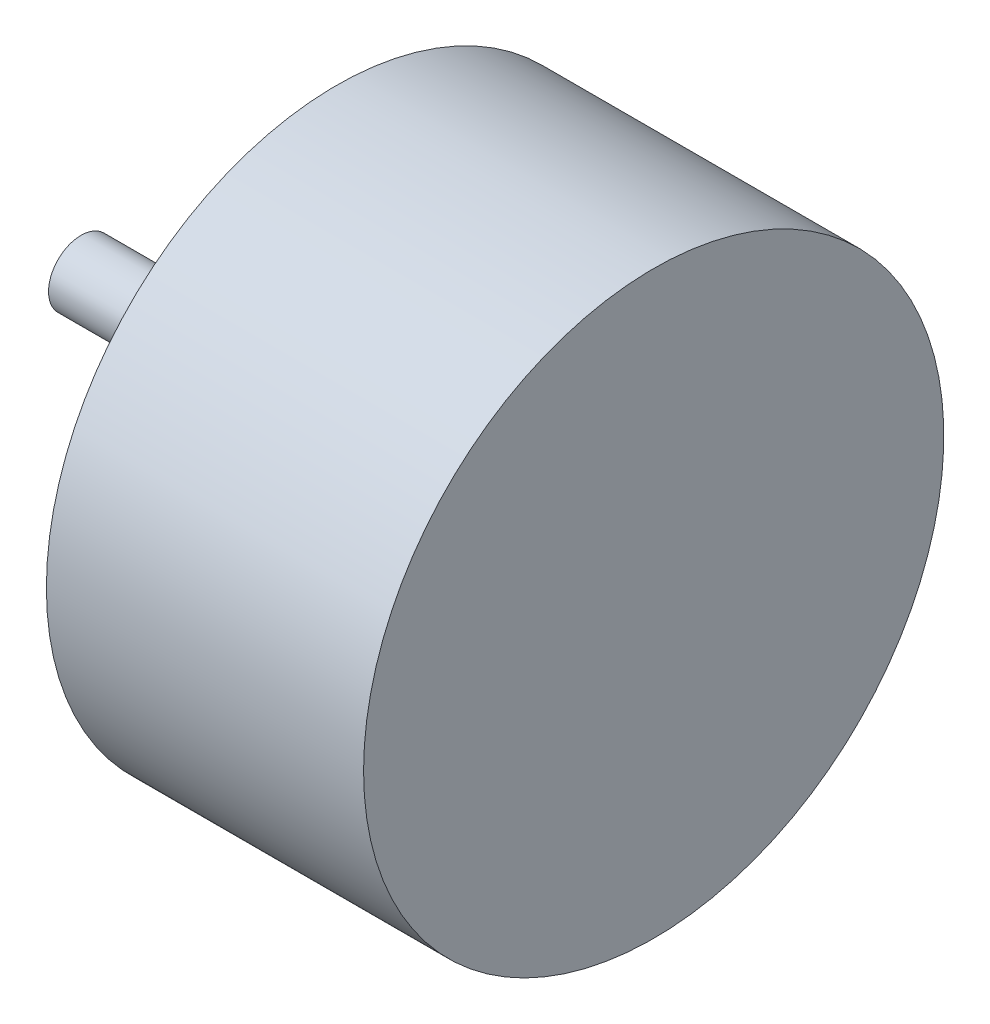
ISO-10303-21;
HEADER;
FILE_DESCRIPTION(('STEP AP214'),'2;1');
FILE_NAME('part.step','',(''),(''),'','','');
FILE_SCHEMA(('AUTOMOTIVE_DESIGN { 1 0 10303 214 1 1 1 1 }'));
ENDSEC;
DATA;
#1=APPLICATION_CONTEXT('core data for automotive mechanical design processes');
#2=APPLICATION_PROTOCOL_DEFINITION('international standard','automotive_design',2000,#1);
#3=PRODUCT_CONTEXT('',#1,'mechanical');
#4=PRODUCT('Part','Part','',(#3));
#5=PRODUCT_RELATED_PRODUCT_CATEGORY('part','',(#4));
#6=PRODUCT_DEFINITION_FORMATION('','',#4);
#7=PRODUCT_DEFINITION_CONTEXT('part definition',#1,'design');
#8=PRODUCT_DEFINITION('design','',#6,#7);
#9=PRODUCT_DEFINITION_SHAPE('','',#8);
#10=(LENGTH_UNIT() NAMED_UNIT(*) SI_UNIT(.MILLI.,.METRE.));
#11=(NAMED_UNIT(*) PLANE_ANGLE_UNIT() SI_UNIT($,.RADIAN.));
#12=(NAMED_UNIT(*) SI_UNIT($,.STERADIAN.) SOLID_ANGLE_UNIT());
#13=UNCERTAINTY_MEASURE_WITH_UNIT(LENGTH_MEASURE(1.E-05),#10,'distance_accuracy_value','');
#14=(GEOMETRIC_REPRESENTATION_CONTEXT(3) GLOBAL_UNCERTAINTY_ASSIGNED_CONTEXT((#13)) GLOBAL_UNIT_ASSIGNED_CONTEXT((#10,
#11,#12)) REPRESENTATION_CONTEXT('',''));
#15=CARTESIAN_POINT('',(0.,0.,0.));
#16=DIRECTION('',(0.,0.,1.));
#17=DIRECTION('',(1.,0.,0.));
#18=AXIS2_PLACEMENT_3D('',#15,#16,#17);
#19=CARTESIAN_POINT('',(-5.9,0.,0.));
#20=DIRECTION('',(-1.,0.,0.));
#21=DIRECTION('',(0.,0.,1.));
#22=AXIS2_PLACEMENT_3D('',#19,#20,#21);
#23=CYLINDRICAL_SURFACE('',#22,13.4);
#24=CARTESIAN_POINT('',(5.9,0.,0.));
#25=DIRECTION('',(-1.,0.,0.));
#26=DIRECTION('',(0.,0.,1.));
#27=AXIS2_PLACEMENT_3D('',#24,#25,#26);
#28=CIRCLE('',#27,13.4);
#29=CARTESIAN_POINT('',(5.9,0.,13.4));
#30=VERTEX_POINT('',#29);
#31=EDGE_CURVE('E10',#30,#30,#28,.T.);
#32=ORIENTED_EDGE('',*,*,#31,.F.);
#33=EDGE_LOOP('',(#32));
#34=FACE_BOUND('',#33,.T.);
#35=CARTESIAN_POINT('',(20.55,0.,0.));
#36=DIRECTION('',(-1.,0.,0.));
#37=DIRECTION('',(0.,0.,1.));
#38=AXIS2_PLACEMENT_3D('',#35,#36,#37);
#39=CIRCLE('',#38,13.4);
#40=CARTESIAN_POINT('',(20.55,0.,13.4));
#41=VERTEX_POINT('',#40);
#42=EDGE_CURVE('E54',#41,#41,#39,.T.);
#43=ORIENTED_EDGE('',*,*,#42,.T.);
#44=EDGE_LOOP('',(#43));
#45=FACE_BOUND('',#44,.T.);
#46=ADVANCED_FACE('F37',(#34,#45),#23,.T.);
#47=CARTESIAN_POINT('',(5.9,13.4,0.));
#48=DIRECTION('',(1.,0.,0.));
#49=DIRECTION('',(0.,0.,-1.));
#50=AXIS2_PLACEMENT_3D('',#47,#48,#49);
#51=PLANE('',#50);
#52=CARTESIAN_POINT('',(5.9,0.,0.));
#53=DIRECTION('',(-1.,0.,0.));
#54=DIRECTION('',(0.,0.,1.));
#55=AXIS2_PLACEMENT_3D('',#52,#53,#54);
#56=CIRCLE('',#55,1.5);
#57=CARTESIAN_POINT('',(5.9,0.,1.5));
#58=VERTEX_POINT('',#57);
#59=EDGE_CURVE('E44',#58,#58,#56,.T.);
#60=ORIENTED_EDGE('',*,*,#59,.F.);
#61=EDGE_LOOP('',(#60));
#62=FACE_BOUND('',#61,.T.);
#63=ORIENTED_EDGE('',*,*,#31,.T.);
#64=EDGE_LOOP('',(#63));
#65=FACE_BOUND('',#64,.T.);
#66=ADVANCED_FACE('F73',(#62,#65),#51,.F.);
#67=CARTESIAN_POINT('',(-5.9,0.,0.));
#68=DIRECTION('',(-1.,0.,0.));
#69=DIRECTION('',(0.,0.,1.));
#70=AXIS2_PLACEMENT_3D('',#67,#68,#69);
#71=CYLINDRICAL_SURFACE('',#70,1.5);
#72=ORIENTED_EDGE('',*,*,#59,.T.);
#73=EDGE_LOOP('',(#72));
#74=FACE_BOUND('',#73,.T.);
#75=CARTESIAN_POINT('',(-5.9,0.,0.));
#76=DIRECTION('',(-1.,0.,0.));
#77=DIRECTION('',(0.,0.,1.));
#78=AXIS2_PLACEMENT_3D('',#75,#76,#77);
#79=CIRCLE('',#78,1.5);
#80=CARTESIAN_POINT('',(-5.9,0.,1.5));
#81=VERTEX_POINT('',#80);
#82=EDGE_CURVE('E49',#81,#81,#79,.T.);
#83=ORIENTED_EDGE('',*,*,#82,.F.);
#84=EDGE_LOOP('',(#83));
#85=FACE_BOUND('',#84,.T.);
#86=ADVANCED_FACE('F69',(#74,#85),#71,.T.);
#87=CARTESIAN_POINT('',(-5.9,0.,0.));
#88=DIRECTION('',(-1.,0.,0.));
#89=DIRECTION('',(0.,0.,1.));
#90=AXIS2_PLACEMENT_3D('',#87,#88,#89);
#91=PLANE('',#90);
#92=ORIENTED_EDGE('',*,*,#82,.T.);
#93=EDGE_LOOP('',(#92));
#94=FACE_BOUND('',#93,.T.);
#95=ADVANCED_FACE('F64',(#94),#91,.T.);
#96=CARTESIAN_POINT('',(20.55,13.4,0.));
#97=DIRECTION('',(1.,0.,0.));
#98=DIRECTION('',(0.,0.,-1.));
#99=AXIS2_PLACEMENT_3D('',#96,#97,#98);
#100=PLANE('',#99);
#101=ORIENTED_EDGE('',*,*,#42,.F.);
#102=EDGE_LOOP('',(#101));
#103=FACE_BOUND('',#102,.T.);
#104=ADVANCED_FACE('F62',(#103),#100,.T.);
#105=CLOSED_SHELL('',(#46,#66,#86,#95,#104));
#106=MANIFOLD_SOLID_BREP('B2',#105);
#107=ADVANCED_BREP_SHAPE_REPRESENTATION('',(#18,#106),#14);
#108=SHAPE_DEFINITION_REPRESENTATION(#9,#107);
ENDSEC;
END-ISO-10303-21;
